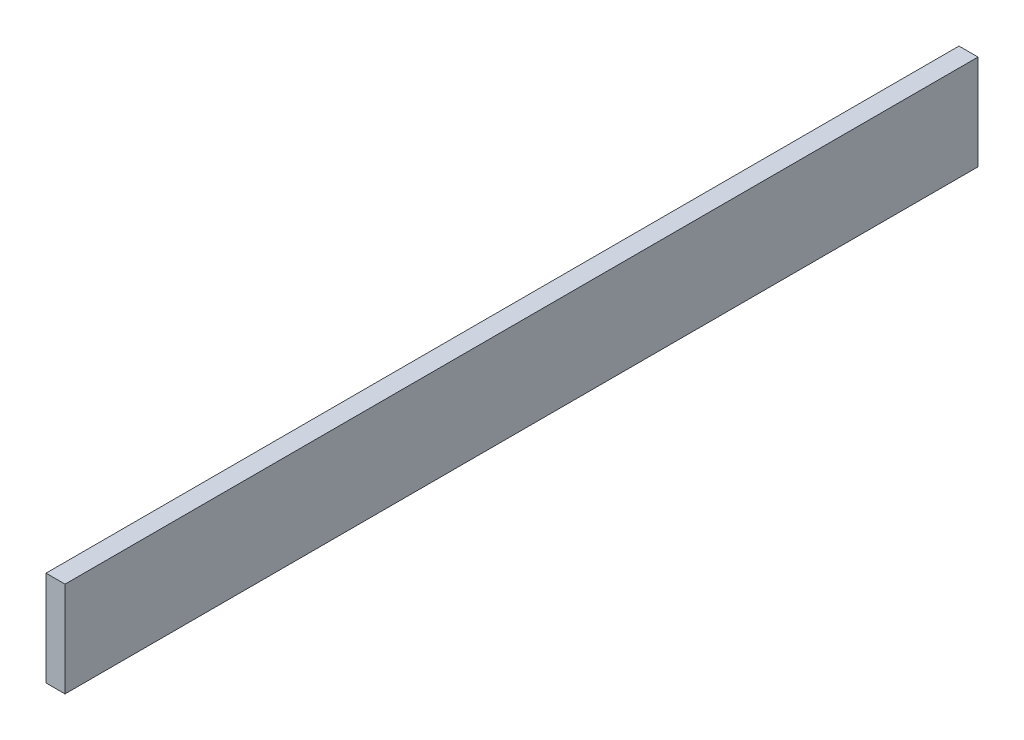
ISO-10303-21;
HEADER;
FILE_DESCRIPTION(('STEP AP214'),'2;1');
FILE_NAME('part.step','',(''),(''),'','','');
FILE_SCHEMA(('AUTOMOTIVE_DESIGN { 1 0 10303 214 1 1 1 1 }'));
ENDSEC;
DATA;
#1=APPLICATION_CONTEXT('core data for automotive mechanical design processes');
#2=APPLICATION_PROTOCOL_DEFINITION('international standard','automotive_design',2000,#1);
#3=PRODUCT_CONTEXT('',#1,'mechanical');
#4=PRODUCT('Part','Part','',(#3));
#5=PRODUCT_RELATED_PRODUCT_CATEGORY('part','',(#4));
#6=PRODUCT_DEFINITION_FORMATION('','',#4);
#7=PRODUCT_DEFINITION_CONTEXT('part definition',#1,'design');
#8=PRODUCT_DEFINITION('design','',#6,#7);
#9=PRODUCT_DEFINITION_SHAPE('','',#8);
#10=(LENGTH_UNIT() NAMED_UNIT(*) SI_UNIT(.MILLI.,.METRE.));
#11=(NAMED_UNIT(*) PLANE_ANGLE_UNIT() SI_UNIT($,.RADIAN.));
#12=(NAMED_UNIT(*) SI_UNIT($,.STERADIAN.) SOLID_ANGLE_UNIT());
#13=UNCERTAINTY_MEASURE_WITH_UNIT(LENGTH_MEASURE(1.E-05),#10,'distance_accuracy_value','');
#14=(GEOMETRIC_REPRESENTATION_CONTEXT(3) GLOBAL_UNCERTAINTY_ASSIGNED_CONTEXT((#13)) GLOBAL_UNIT_ASSIGNED_CONTEXT((#10,
#11,#12)) REPRESENTATION_CONTEXT('',''));
#15=CARTESIAN_POINT('',(0.,0.,0.));
#16=DIRECTION('',(0.,0.,1.));
#17=DIRECTION('',(1.,0.,0.));
#18=AXIS2_PLACEMENT_3D('',#15,#16,#17);
#19=CARTESIAN_POINT('',(9.99999999999999,50.,960.));
#20=DIRECTION('',(-1.,0.,0.));
#21=DIRECTION('',(0.,-1.,0.));
#22=AXIS2_PLACEMENT_3D('',#19,#20,#21);
#23=PLANE('',#22);
#24=DIRECTION('',(0.,1.,0.));
#25=VECTOR('',#24,1.);
#26=CARTESIAN_POINT('',(9.99999999999999,50.,0.));
#27=LINE('',#26,#25);
#28=CARTESIAN_POINT('',(10.,-50.,0.));
#29=VERTEX_POINT('',#28);
#30=CARTESIAN_POINT('',(9.99999999999999,50.,0.));
#31=VERTEX_POINT('',#30);
#32=EDGE_CURVE('E96',#29,#31,#27,.T.);
#33=ORIENTED_EDGE('',*,*,#32,.T.);
#34=DIRECTION('',(0.,0.,-1.));
#35=VECTOR('',#34,1.);
#36=CARTESIAN_POINT('',(9.99999999999999,50.,960.));
#37=LINE('',#36,#35);
#38=CARTESIAN_POINT('',(9.99999999999999,50.,960.));
#39=VERTEX_POINT('',#38);
#40=EDGE_CURVE('E11',#39,#31,#37,.T.);
#41=ORIENTED_EDGE('',*,*,#40,.F.);
#42=DIRECTION('',(0.,1.,0.));
#43=VECTOR('',#42,1.);
#44=CARTESIAN_POINT('',(9.99999999999999,50.,960.));
#45=LINE('',#44,#43);
#46=CARTESIAN_POINT('',(10.,-50.,960.));
#47=VERTEX_POINT('',#46);
#48=EDGE_CURVE('E84',#47,#39,#45,.T.);
#49=ORIENTED_EDGE('',*,*,#48,.F.);
#50=DIRECTION('',(0.,0.,-1.));
#51=VECTOR('',#50,1.);
#52=CARTESIAN_POINT('',(10.,-50.,960.));
#53=LINE('',#52,#51);
#54=EDGE_CURVE('E92',#47,#29,#53,.T.);
#55=ORIENTED_EDGE('',*,*,#54,.T.);
#56=EDGE_LOOP('',(#33,#41,#49,#55));
#57=FACE_BOUND('',#56,.T.);
#58=ADVANCED_FACE('F33',(#57),#23,.F.);
#59=CARTESIAN_POINT('',(-10.,50.,960.));
#60=DIRECTION('',(0.,-1.,0.));
#61=DIRECTION('',(0.,0.,-1.));
#62=AXIS2_PLACEMENT_3D('',#59,#60,#61);
#63=PLANE('',#62);
#64=DIRECTION('',(-1.,0.,0.));
#65=VECTOR('',#64,1.);
#66=CARTESIAN_POINT('',(-10.,50.,0.));
#67=LINE('',#66,#65);
#68=CARTESIAN_POINT('',(-10.,50.,0.));
#69=VERTEX_POINT('',#68);
#70=EDGE_CURVE('E88',#31,#69,#67,.T.);
#71=ORIENTED_EDGE('',*,*,#70,.T.);
#72=DIRECTION('',(0.,0.,-1.));
#73=VECTOR('',#72,1.);
#74=CARTESIAN_POINT('',(-10.,50.,960.));
#75=LINE('',#74,#73);
#76=CARTESIAN_POINT('',(-10.,50.,960.));
#77=VERTEX_POINT('',#76);
#78=EDGE_CURVE('E41',#77,#69,#75,.T.);
#79=ORIENTED_EDGE('',*,*,#78,.F.);
#80=DIRECTION('',(-1.,0.,0.));
#81=VECTOR('',#80,1.);
#82=CARTESIAN_POINT('',(-10.,50.,960.));
#83=LINE('',#82,#81);
#84=EDGE_CURVE('E79',#39,#77,#83,.T.);
#85=ORIENTED_EDGE('',*,*,#84,.F.);
#86=ORIENTED_EDGE('',*,*,#40,.T.);
#87=EDGE_LOOP('',(#71,#79,#85,#86));
#88=FACE_BOUND('',#87,.T.);
#89=ADVANCED_FACE('F87',(#88),#63,.F.);
#90=CARTESIAN_POINT('',(-10.,50.,960.));
#91=DIRECTION('',(1.,0.,0.));
#92=DIRECTION('',(0.,1.,0.));
#93=AXIS2_PLACEMENT_3D('',#90,#91,#92);
#94=PLANE('',#93);
#95=DIRECTION('',(0.,-1.,0.));
#96=VECTOR('',#95,1.);
#97=CARTESIAN_POINT('',(-10.,50.,0.));
#98=LINE('',#97,#96);
#99=CARTESIAN_POINT('',(-9.99999999999999,-50.,0.));
#100=VERTEX_POINT('',#99);
#101=EDGE_CURVE('E66',#69,#100,#98,.T.);
#102=ORIENTED_EDGE('',*,*,#101,.T.);
#103=DIRECTION('',(0.,0.,-1.));
#104=VECTOR('',#103,1.);
#105=CARTESIAN_POINT('',(-9.99999999999999,-50.,960.));
#106=LINE('',#105,#104);
#107=CARTESIAN_POINT('',(-9.99999999999999,-50.,960.));
#108=VERTEX_POINT('',#107);
#109=EDGE_CURVE('E89',#108,#100,#106,.T.);
#110=ORIENTED_EDGE('',*,*,#109,.F.);
#111=DIRECTION('',(0.,-1.,0.));
#112=VECTOR('',#111,1.);
#113=CARTESIAN_POINT('',(-10.,50.,960.));
#114=LINE('',#113,#112);
#115=EDGE_CURVE('E82',#77,#108,#114,.T.);
#116=ORIENTED_EDGE('',*,*,#115,.F.);
#117=ORIENTED_EDGE('',*,*,#78,.T.);
#118=EDGE_LOOP('',(#102,#110,#116,#117));
#119=FACE_BOUND('',#118,.T.);
#120=ADVANCED_FACE('F90',(#119),#94,.F.);
#121=CARTESIAN_POINT('',(-9.99999999999999,-50.,960.));
#122=DIRECTION('',(0.,1.,0.));
#123=DIRECTION('',(0.,0.,1.));
#124=AXIS2_PLACEMENT_3D('',#121,#122,#123);
#125=PLANE('',#124);
#126=DIRECTION('',(1.,0.,0.));
#127=VECTOR('',#126,1.);
#128=CARTESIAN_POINT('',(-9.99999999999999,-50.,0.));
#129=LINE('',#128,#127);
#130=EDGE_CURVE('E72',#100,#29,#129,.T.);
#131=ORIENTED_EDGE('',*,*,#130,.T.);
#132=ORIENTED_EDGE('',*,*,#54,.F.);
#133=DIRECTION('',(1.,0.,0.));
#134=VECTOR('',#133,1.);
#135=CARTESIAN_POINT('',(-9.99999999999999,-50.,960.));
#136=LINE('',#135,#134);
#137=EDGE_CURVE('E49',#108,#47,#136,.T.);
#138=ORIENTED_EDGE('',*,*,#137,.F.);
#139=ORIENTED_EDGE('',*,*,#109,.T.);
#140=EDGE_LOOP('',(#131,#132,#138,#139));
#141=FACE_BOUND('',#140,.T.);
#142=ADVANCED_FACE('F103',(#141),#125,.F.);
#143=CARTESIAN_POINT('',(0.,0.,960.));
#144=DIRECTION('',(0.,0.,1.));
#145=DIRECTION('',(1.,0.,0.));
#146=AXIS2_PLACEMENT_3D('',#143,#144,#145);
#147=PLANE('',#146);
#148=ORIENTED_EDGE('',*,*,#48,.T.);
#149=ORIENTED_EDGE('',*,*,#84,.T.);
#150=ORIENTED_EDGE('',*,*,#115,.T.);
#151=ORIENTED_EDGE('',*,*,#137,.T.);
#152=EDGE_LOOP('',(#148,#149,#150,#151));
#153=FACE_BOUND('',#152,.T.);
#154=ADVANCED_FACE('F80',(#153),#147,.T.);
#155=CARTESIAN_POINT('',(0.,0.,0.));
#156=DIRECTION('',(0.,0.,1.));
#157=DIRECTION('',(1.,0.,0.));
#158=AXIS2_PLACEMENT_3D('',#155,#156,#157);
#159=PLANE('',#158);
#160=ORIENTED_EDGE('',*,*,#32,.F.);
#161=ORIENTED_EDGE('',*,*,#130,.F.);
#162=ORIENTED_EDGE('',*,*,#101,.F.);
#163=ORIENTED_EDGE('',*,*,#70,.F.);
#164=EDGE_LOOP('',(#160,#161,#162,#163));
#165=FACE_BOUND('',#164,.T.);
#166=ADVANCED_FACE('F106',(#165),#159,.F.);
#167=CLOSED_SHELL('',(#58,#89,#120,#142,#154,#166));
#168=MANIFOLD_SOLID_BREP('B2',#167);
#169=ADVANCED_BREP_SHAPE_REPRESENTATION('',(#18,#168),#14);
#170=SHAPE_DEFINITION_REPRESENTATION(#9,#169);
ENDSEC;
END-ISO-10303-21;
